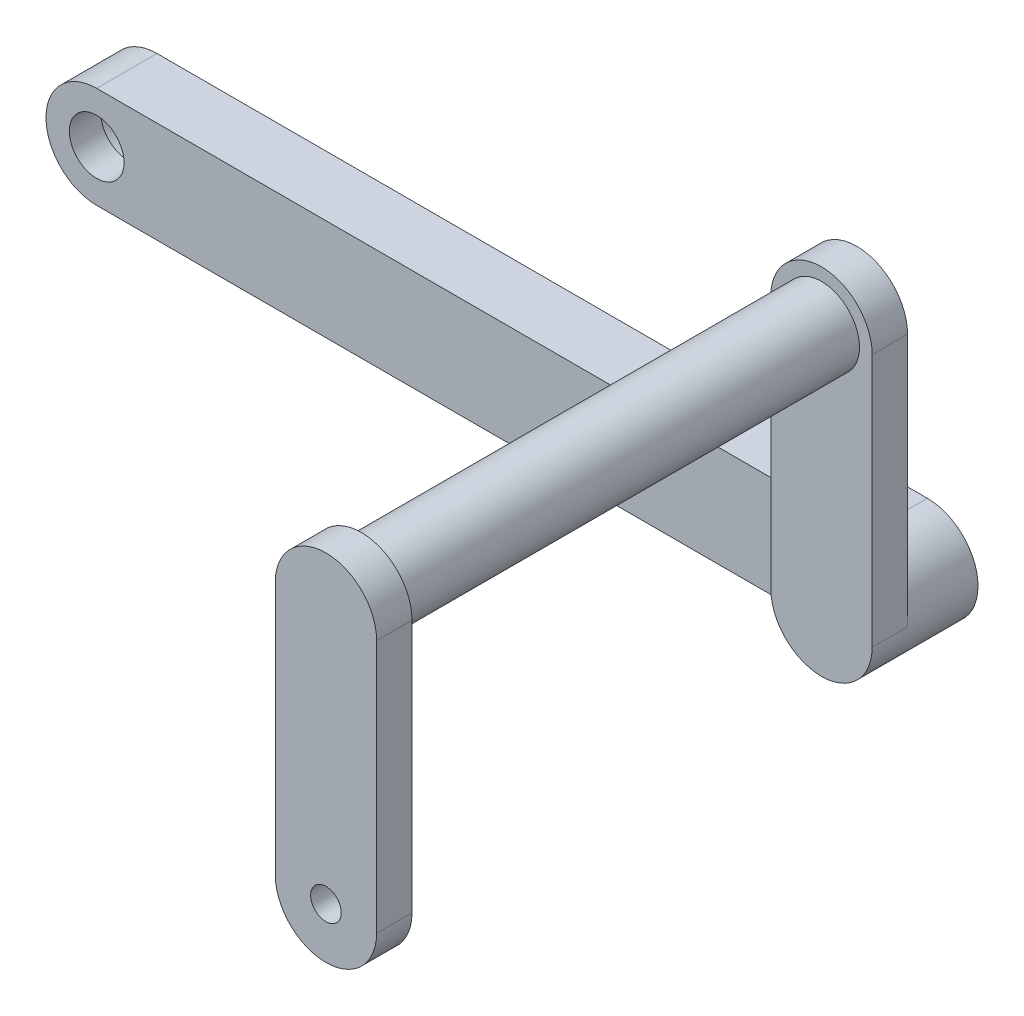
ISO-10303-21;
HEADER;
FILE_DESCRIPTION(('STEP AP214'),'2;1');
FILE_NAME('part.step','',(''),(''),'','','');
FILE_SCHEMA(('AUTOMOTIVE_DESIGN { 1 0 10303 214 1 1 1 1 }'));
ENDSEC;
DATA;
#1=APPLICATION_CONTEXT('core data for automotive mechanical design processes');
#2=APPLICATION_PROTOCOL_DEFINITION('international standard','automotive_design',2000,#1);
#3=PRODUCT_CONTEXT('',#1,'mechanical');
#4=PRODUCT('Part','Part','',(#3));
#5=PRODUCT_RELATED_PRODUCT_CATEGORY('part','',(#4));
#6=PRODUCT_DEFINITION_FORMATION('','',#4);
#7=PRODUCT_DEFINITION_CONTEXT('part definition',#1,'design');
#8=PRODUCT_DEFINITION('design','',#6,#7);
#9=PRODUCT_DEFINITION_SHAPE('','',#8);
#10=(LENGTH_UNIT() NAMED_UNIT(*) SI_UNIT(.MILLI.,.METRE.));
#11=(NAMED_UNIT(*) PLANE_ANGLE_UNIT() SI_UNIT($,.RADIAN.));
#12=(NAMED_UNIT(*) SI_UNIT($,.STERADIAN.) SOLID_ANGLE_UNIT());
#13=UNCERTAINTY_MEASURE_WITH_UNIT(LENGTH_MEASURE(1.E-05),#10,'distance_accuracy_value','');
#14=(GEOMETRIC_REPRESENTATION_CONTEXT(3) GLOBAL_UNCERTAINTY_ASSIGNED_CONTEXT((#13)) GLOBAL_UNIT_ASSIGNED_CONTEXT((#10,
#11,#12)) REPRESENTATION_CONTEXT('',''));
#15=CARTESIAN_POINT('',(0.,0.,0.));
#16=DIRECTION('',(0.,0.,1.));
#17=DIRECTION('',(1.,0.,0.));
#18=AXIS2_PLACEMENT_3D('',#15,#16,#17);
#19=CARTESIAN_POINT('',(0.,0.,3.75));
#20=DIRECTION('',(0.,0.,-1.));
#21=DIRECTION('',(-1.,0.,0.));
#22=AXIS2_PLACEMENT_3D('',#19,#20,#21);
#23=CYLINDRICAL_SURFACE('',#22,1.7);
#24=CARTESIAN_POINT('',(0.,0.,3.75));
#25=DIRECTION('',(0.,0.,1.));
#26=DIRECTION('',(1.,0.,0.));
#27=AXIS2_PLACEMENT_3D('',#24,#25,#26);
#28=CIRCLE('',#27,1.7);
#29=CARTESIAN_POINT('',(1.7,0.,3.75));
#30=VERTEX_POINT('',#29);
#31=EDGE_CURVE('E208',#30,#30,#28,.T.);
#32=ORIENTED_EDGE('',*,*,#31,.T.);
#33=EDGE_LOOP('',(#32));
#34=FACE_BOUND('',#33,.T.);
#35=CARTESIAN_POINT('',(0.,0.,1.8));
#36=DIRECTION('',(0.,0.,-1.));
#37=DIRECTION('',(-1.,0.,0.));
#38=AXIS2_PLACEMENT_3D('',#35,#36,#37);
#39=CIRCLE('',#38,1.7);
#40=CARTESIAN_POINT('',(-1.7,0.,1.8));
#41=VERTEX_POINT('',#40);
#42=EDGE_CURVE('E45',#41,#41,#39,.T.);
#43=ORIENTED_EDGE('',*,*,#42,.T.);
#44=EDGE_LOOP('',(#43));
#45=FACE_BOUND('',#44,.T.);
#46=ADVANCED_FACE('F41',(#34,#45),#23,.F.);
#47=CARTESIAN_POINT('',(47.88,0.,37.38));
#48=DIRECTION('',(0.,0.,-1.));
#49=DIRECTION('',(-1.,0.,0.));
#50=AXIS2_PLACEMENT_3D('',#47,#48,#49);
#51=CYLINDRICAL_SURFACE('',#50,0.950000000000001);
#52=CARTESIAN_POINT('',(47.88,0.,37.38));
#53=DIRECTION('',(0.,0.,1.));
#54=DIRECTION('',(1.,0.,0.));
#55=AXIS2_PLACEMENT_3D('',#52,#53,#54);
#56=CIRCLE('',#55,0.950000000000001);
#57=CARTESIAN_POINT('',(48.83,0.,37.38));
#58=VERTEX_POINT('',#57);
#59=EDGE_CURVE('E232',#58,#58,#56,.T.);
#60=ORIENTED_EDGE('',*,*,#59,.T.);
#61=EDGE_LOOP('',(#60));
#62=FACE_BOUND('',#61,.T.);
#63=CARTESIAN_POINT('',(47.88,0.,35.68));
#64=DIRECTION('',(0.,0.,-1.));
#65=DIRECTION('',(-1.,0.,0.));
#66=AXIS2_PLACEMENT_3D('',#63,#64,#65);
#67=CIRCLE('',#66,0.950000000000001);
#68=CARTESIAN_POINT('',(46.93,0.,35.68));
#69=VERTEX_POINT('',#68);
#70=EDGE_CURVE('E230',#69,#69,#67,.T.);
#71=ORIENTED_EDGE('',*,*,#70,.T.);
#72=EDGE_LOOP('',(#71));
#73=FACE_BOUND('',#72,.T.);
#74=ADVANCED_FACE('F278',(#62,#73),#51,.F.);
#75=CARTESIAN_POINT('',(0.,0.,3.75));
#76=DIRECTION('',(0.,0.,1.));
#77=DIRECTION('',(1.,0.,0.));
#78=AXIS2_PLACEMENT_3D('',#75,#76,#77);
#79=PLANE('',#78);
#80=CARTESIAN_POINT('',(47.88,0.,3.75));
#81=DIRECTION('',(0.,0.,1.));
#82=DIRECTION('',(1.,0.,0.));
#83=AXIS2_PLACEMENT_3D('',#80,#81,#82);
#84=CIRCLE('',#83,3.15);
#85=CARTESIAN_POINT('',(47.88,3.15,3.75));
#86=VERTEX_POINT('',#85);
#87=CARTESIAN_POINT('',(47.88,-3.15,3.75));
#88=VERTEX_POINT('',#87);
#89=EDGE_CURVE('E206',#86,#88,#84,.T.);
#90=ORIENTED_EDGE('',*,*,#89,.F.);
#91=DIRECTION('',(-1.,0.,0.));
#92=VECTOR('',#91,1.);
#93=CARTESIAN_POINT('',(0.,3.15,3.75));
#94=LINE('',#93,#92);
#95=CARTESIAN_POINT('',(0.,3.15,3.75));
#96=VERTEX_POINT('',#95);
#97=EDGE_CURVE('E67',#86,#96,#94,.T.);
#98=ORIENTED_EDGE('',*,*,#97,.T.);
#99=CARTESIAN_POINT('',(0.,0.,3.75));
#100=DIRECTION('',(0.,0.,1.));
#101=DIRECTION('',(1.,0.,0.));
#102=AXIS2_PLACEMENT_3D('',#99,#100,#101);
#103=CIRCLE('',#102,3.15);
#104=CARTESIAN_POINT('',(0.,-3.15,3.75));
#105=VERTEX_POINT('',#104);
#106=EDGE_CURVE('E214',#96,#105,#103,.T.);
#107=ORIENTED_EDGE('',*,*,#106,.T.);
#108=DIRECTION('',(1.,0.,0.));
#109=VECTOR('',#108,1.);
#110=CARTESIAN_POINT('',(0.,-3.15,3.75));
#111=LINE('',#110,#109);
#112=EDGE_CURVE('E93',#105,#88,#111,.T.);
#113=ORIENTED_EDGE('',*,*,#112,.T.);
#114=EDGE_LOOP('',(#90,#98,#107,#113));
#115=FACE_BOUND('',#114,.T.);
#116=ORIENTED_EDGE('',*,*,#31,.F.);
#117=EDGE_LOOP('',(#116));
#118=FACE_BOUND('',#117,.T.);
#119=ADVANCED_FACE('F286',(#115,#118),#79,.T.);
#120=CARTESIAN_POINT('',(0.,0.,0.));
#121=DIRECTION('',(0.,0.,1.));
#122=DIRECTION('',(1.,0.,0.));
#123=AXIS2_PLACEMENT_3D('',#120,#121,#122);
#124=PLANE('',#123);
#125=CARTESIAN_POINT('',(0.,0.,0.));
#126=DIRECTION('',(0.,0.,-1.));
#127=DIRECTION('',(-1.,0.,0.));
#128=AXIS2_PLACEMENT_3D('',#125,#126,#127);
#129=CIRCLE('',#128,2.5);
#130=CARTESIAN_POINT('',(-2.5,0.,0.));
#131=VERTEX_POINT('',#130);
#132=EDGE_CURVE('E246',#131,#131,#129,.T.);
#133=ORIENTED_EDGE('',*,*,#132,.F.);
#134=EDGE_LOOP('',(#133));
#135=FACE_BOUND('',#134,.T.);
#136=CARTESIAN_POINT('',(0.,0.,0.));
#137=DIRECTION('',(0.,0.,1.));
#138=DIRECTION('',(1.,0.,0.));
#139=AXIS2_PLACEMENT_3D('',#136,#137,#138);
#140=CIRCLE('',#139,3.15);
#141=CARTESIAN_POINT('',(0.,3.15,0.));
#142=VERTEX_POINT('',#141);
#143=CARTESIAN_POINT('',(0.,-3.15,0.));
#144=VERTEX_POINT('',#143);
#145=EDGE_CURVE('E213',#142,#144,#140,.T.);
#146=ORIENTED_EDGE('',*,*,#145,.F.);
#147=DIRECTION('',(-1.,0.,0.));
#148=VECTOR('',#147,1.);
#149=CARTESIAN_POINT('',(0.,3.15,0.));
#150=LINE('',#149,#148);
#151=CARTESIAN_POINT('',(47.88,3.15,0.));
#152=VERTEX_POINT('',#151);
#153=EDGE_CURVE('E88',#152,#142,#150,.T.);
#154=ORIENTED_EDGE('',*,*,#153,.F.);
#155=CARTESIAN_POINT('',(47.88,0.,0.));
#156=DIRECTION('',(0.,0.,1.));
#157=DIRECTION('',(1.,0.,0.));
#158=AXIS2_PLACEMENT_3D('',#155,#156,#157);
#159=CIRCLE('',#158,3.15);
#160=CARTESIAN_POINT('',(47.88,-3.15,0.));
#161=VERTEX_POINT('',#160);
#162=EDGE_CURVE('E223',#161,#152,#159,.T.);
#163=ORIENTED_EDGE('',*,*,#162,.F.);
#164=DIRECTION('',(1.,0.,0.));
#165=VECTOR('',#164,1.);
#166=CARTESIAN_POINT('',(0.,-3.15,0.));
#167=LINE('',#166,#165);
#168=EDGE_CURVE('E221',#144,#161,#167,.T.);
#169=ORIENTED_EDGE('',*,*,#168,.F.);
#170=EDGE_LOOP('',(#146,#154,#163,#169));
#171=FACE_BOUND('',#170,.T.);
#172=ADVANCED_FACE('F296',(#135,#171),#124,.F.);
#173=CARTESIAN_POINT('',(0.,0.,3.75));
#174=DIRECTION('',(0.,0.,-1.));
#175=DIRECTION('',(-1.,0.,0.));
#176=AXIS2_PLACEMENT_3D('',#173,#174,#175);
#177=CYLINDRICAL_SURFACE('',#176,3.15);
#178=ORIENTED_EDGE('',*,*,#145,.T.);
#179=DIRECTION('',(0.,0.,-1.));
#180=VECTOR('',#179,1.);
#181=CARTESIAN_POINT('',(0.,-3.15,3.75));
#182=LINE('',#181,#180);
#183=EDGE_CURVE('E11',#105,#144,#182,.T.);
#184=ORIENTED_EDGE('',*,*,#183,.F.);
#185=ORIENTED_EDGE('',*,*,#106,.F.);
#186=DIRECTION('',(0.,0.,-1.));
#187=VECTOR('',#186,1.);
#188=CARTESIAN_POINT('',(0.,3.15,3.75));
#189=LINE('',#188,#187);
#190=EDGE_CURVE('E218',#96,#142,#189,.T.);
#191=ORIENTED_EDGE('',*,*,#190,.T.);
#192=EDGE_LOOP('',(#178,#184,#185,#191));
#193=FACE_BOUND('',#192,.T.);
#194=ADVANCED_FACE('F43',(#193),#177,.T.);
#195=CARTESIAN_POINT('',(0.,-3.15,3.75));
#196=DIRECTION('',(0.,1.,0.));
#197=DIRECTION('',(-1.,0.,0.));
#198=AXIS2_PLACEMENT_3D('',#195,#196,#197);
#199=PLANE('',#198);
#200=ORIENTED_EDGE('',*,*,#168,.T.);
#201=DIRECTION('',(0.,0.,-1.));
#202=VECTOR('',#201,1.);
#203=CARTESIAN_POINT('',(47.88,-3.15,3.75));
#204=LINE('',#203,#202);
#205=EDGE_CURVE('E50',#88,#161,#204,.T.);
#206=ORIENTED_EDGE('',*,*,#205,.F.);
#207=ORIENTED_EDGE('',*,*,#112,.F.);
#208=ORIENTED_EDGE('',*,*,#183,.T.);
#209=EDGE_LOOP('',(#200,#206,#207,#208));
#210=FACE_BOUND('',#209,.T.);
#211=ADVANCED_FACE('F305',(#210),#199,.F.);
#212=CARTESIAN_POINT('',(47.88,0.,3.75));
#213=DIRECTION('',(0.,0.,-1.));
#214=DIRECTION('',(-1.,0.,0.));
#215=AXIS2_PLACEMENT_3D('',#212,#213,#214);
#216=CYLINDRICAL_SURFACE('',#215,3.15);
#217=ORIENTED_EDGE('',*,*,#162,.T.);
#218=DIRECTION('',(0.,0.,-1.));
#219=VECTOR('',#218,1.);
#220=CARTESIAN_POINT('',(47.88,3.15,3.75));
#221=LINE('',#220,#219);
#222=EDGE_CURVE('E227',#86,#152,#221,.T.);
#223=ORIENTED_EDGE('',*,*,#222,.F.);
#224=ORIENTED_EDGE('',*,*,#89,.T.);
#225=ORIENTED_EDGE('',*,*,#205,.T.);
#226=EDGE_LOOP('',(#217,#223,#224,#225));
#227=FACE_BOUND('',#226,.T.);
#228=CARTESIAN_POINT('',(47.88,0.,4.38));
#229=DIRECTION('',(0.,0.,1.));
#230=DIRECTION('',(1.,0.,0.));
#231=AXIS2_PLACEMENT_3D('',#228,#229,#230);
#232=CIRCLE('',#231,3.15);
#233=CARTESIAN_POINT('',(51.03,0.,4.38));
#234=VERTEX_POINT('',#233);
#235=CARTESIAN_POINT('',(44.73,0.,4.38));
#236=VERTEX_POINT('',#235);
#237=EDGE_CURVE('E58',#234,#236,#232,.T.);
#238=ORIENTED_EDGE('',*,*,#237,.F.);
#239=DIRECTION('',(0.,0.,-1.));
#240=VECTOR('',#239,1.);
#241=CARTESIAN_POINT('',(51.03,0.,6.58));
#242=LINE('',#241,#240);
#243=CARTESIAN_POINT('',(51.03,0.,6.58));
#244=VERTEX_POINT('',#243);
#245=EDGE_CURVE('E197',#244,#234,#242,.T.);
#246=ORIENTED_EDGE('',*,*,#245,.F.);
#247=CARTESIAN_POINT('',(47.88,0.,6.58));
#248=DIRECTION('',(0.,0.,1.));
#249=DIRECTION('',(1.,0.,0.));
#250=AXIS2_PLACEMENT_3D('',#247,#248,#249);
#251=CIRCLE('',#250,3.15);
#252=CARTESIAN_POINT('',(44.73,0.,6.58));
#253=VERTEX_POINT('',#252);
#254=EDGE_CURVE('E185',#253,#244,#251,.T.);
#255=ORIENTED_EDGE('',*,*,#254,.F.);
#256=DIRECTION('',(0.,0.,-1.));
#257=VECTOR('',#256,1.);
#258=CARTESIAN_POINT('',(44.73,0.,6.58));
#259=LINE('',#258,#257);
#260=EDGE_CURVE('E200',#253,#236,#259,.T.);
#261=ORIENTED_EDGE('',*,*,#260,.T.);
#262=EDGE_LOOP('',(#238,#246,#255,#261));
#263=FACE_BOUND('',#262,.T.);
#264=ADVANCED_FACE('F303',(#227,#263),#216,.T.);
#265=CARTESIAN_POINT('',(0.,3.15,3.75));
#266=DIRECTION('',(0.,-1.,0.));
#267=DIRECTION('',(1.,0.,0.));
#268=AXIS2_PLACEMENT_3D('',#265,#266,#267);
#269=PLANE('',#268);
#270=ORIENTED_EDGE('',*,*,#153,.T.);
#271=ORIENTED_EDGE('',*,*,#190,.F.);
#272=ORIENTED_EDGE('',*,*,#97,.F.);
#273=ORIENTED_EDGE('',*,*,#222,.T.);
#274=EDGE_LOOP('',(#270,#271,#272,#273));
#275=FACE_BOUND('',#274,.T.);
#276=ADVANCED_FACE('F299',(#275),#269,.F.);
#277=CARTESIAN_POINT('',(47.88,15.75,4.38));
#278=DIRECTION('',(0.,0.,1.));
#279=DIRECTION('',(1.,0.,0.));
#280=AXIS2_PLACEMENT_3D('',#277,#278,#279);
#281=PLANE('',#280);
#282=DIRECTION('',(0.,1.,0.));
#283=VECTOR('',#282,1.);
#284=CARTESIAN_POINT('',(51.03,15.75,4.38));
#285=LINE('',#284,#283);
#286=CARTESIAN_POINT('',(51.03,15.75,4.38));
#287=VERTEX_POINT('',#286);
#288=EDGE_CURVE('E183',#234,#287,#285,.T.);
#289=ORIENTED_EDGE('',*,*,#288,.F.);
#290=ORIENTED_EDGE('',*,*,#237,.T.);
#291=DIRECTION('',(0.,-1.,0.));
#292=VECTOR('',#291,1.);
#293=CARTESIAN_POINT('',(44.73,15.75,4.38));
#294=LINE('',#293,#292);
#295=CARTESIAN_POINT('',(44.73,15.75,4.38));
#296=VERTEX_POINT('',#295);
#297=EDGE_CURVE('E192',#296,#236,#294,.T.);
#298=ORIENTED_EDGE('',*,*,#297,.F.);
#299=CARTESIAN_POINT('',(47.88,15.75,4.38));
#300=DIRECTION('',(0.,0.,1.));
#301=DIRECTION('',(1.,0.,0.));
#302=AXIS2_PLACEMENT_3D('',#299,#300,#301);
#303=CIRCLE('',#302,3.15);
#304=EDGE_CURVE('E177',#287,#296,#303,.T.);
#305=ORIENTED_EDGE('',*,*,#304,.F.);
#306=EDGE_LOOP('',(#289,#290,#298,#305));
#307=FACE_BOUND('',#306,.T.);
#308=ADVANCED_FACE('F302',(#307),#281,.F.);
#309=CARTESIAN_POINT('',(47.88,15.75,6.58));
#310=DIRECTION('',(0.,0.,-1.));
#311=DIRECTION('',(-1.,0.,0.));
#312=AXIS2_PLACEMENT_3D('',#309,#310,#311);
#313=CYLINDRICAL_SURFACE('',#312,3.15);
#314=ORIENTED_EDGE('',*,*,#304,.T.);
#315=DIRECTION('',(0.,0.,-1.));
#316=VECTOR('',#315,1.);
#317=CARTESIAN_POINT('',(44.73,15.75,6.58));
#318=LINE('',#317,#316);
#319=CARTESIAN_POINT('',(44.73,15.75,6.58));
#320=VERTEX_POINT('',#319);
#321=EDGE_CURVE('E203',#320,#296,#318,.T.);
#322=ORIENTED_EDGE('',*,*,#321,.F.);
#323=CARTESIAN_POINT('',(47.88,15.75,6.58));
#324=DIRECTION('',(0.,0.,1.));
#325=DIRECTION('',(1.,0.,0.));
#326=AXIS2_PLACEMENT_3D('',#323,#324,#325);
#327=CIRCLE('',#326,3.15);
#328=CARTESIAN_POINT('',(51.03,15.75,6.58));
#329=VERTEX_POINT('',#328);
#330=EDGE_CURVE('E179',#329,#320,#327,.T.);
#331=ORIENTED_EDGE('',*,*,#330,.F.);
#332=DIRECTION('',(0.,0.,-1.));
#333=VECTOR('',#332,1.);
#334=CARTESIAN_POINT('',(51.03,15.75,6.58));
#335=LINE('',#334,#333);
#336=EDGE_CURVE('E189',#329,#287,#335,.T.);
#337=ORIENTED_EDGE('',*,*,#336,.T.);
#338=EDGE_LOOP('',(#314,#322,#331,#337));
#339=FACE_BOUND('',#338,.T.);
#340=ADVANCED_FACE('F292',(#339),#313,.T.);
#341=CARTESIAN_POINT('',(44.73,15.75,6.58));
#342=DIRECTION('',(1.,0.,0.));
#343=DIRECTION('',(0.,0.,-1.));
#344=AXIS2_PLACEMENT_3D('',#341,#342,#343);
#345=PLANE('',#344);
#346=ORIENTED_EDGE('',*,*,#297,.T.);
#347=ORIENTED_EDGE('',*,*,#260,.F.);
#348=DIRECTION('',(0.,-1.,0.));
#349=VECTOR('',#348,1.);
#350=CARTESIAN_POINT('',(44.73,15.75,6.58));
#351=LINE('',#350,#349);
#352=EDGE_CURVE('E182',#320,#253,#351,.T.);
#353=ORIENTED_EDGE('',*,*,#352,.F.);
#354=ORIENTED_EDGE('',*,*,#321,.T.);
#355=EDGE_LOOP('',(#346,#347,#353,#354));
#356=FACE_BOUND('',#355,.T.);
#357=ADVANCED_FACE('F335',(#356),#345,.F.);
#358=CARTESIAN_POINT('',(51.03,15.75,6.58));
#359=DIRECTION('',(-1.,0.,0.));
#360=DIRECTION('',(0.,0.,1.));
#361=AXIS2_PLACEMENT_3D('',#358,#359,#360);
#362=PLANE('',#361);
#363=ORIENTED_EDGE('',*,*,#288,.T.);
#364=ORIENTED_EDGE('',*,*,#336,.F.);
#365=DIRECTION('',(0.,1.,0.));
#366=VECTOR('',#365,1.);
#367=CARTESIAN_POINT('',(51.03,15.75,6.58));
#368=LINE('',#367,#366);
#369=EDGE_CURVE('E187',#244,#329,#368,.T.);
#370=ORIENTED_EDGE('',*,*,#369,.F.);
#371=ORIENTED_EDGE('',*,*,#245,.T.);
#372=EDGE_LOOP('',(#363,#364,#370,#371));
#373=FACE_BOUND('',#372,.T.);
#374=ADVANCED_FACE('F326',(#373),#362,.F.);
#375=CARTESIAN_POINT('',(47.88,15.75,6.58));
#376=DIRECTION('',(0.,0.,1.));
#377=DIRECTION('',(1.,0.,0.));
#378=AXIS2_PLACEMENT_3D('',#375,#376,#377);
#379=PLANE('',#378);
#380=CARTESIAN_POINT('',(47.88,15.75,6.58));
#381=DIRECTION('',(0.,0.,1.));
#382=DIRECTION('',(1.,0.,0.));
#383=AXIS2_PLACEMENT_3D('',#380,#381,#382);
#384=CIRCLE('',#383,2.365);
#385=CARTESIAN_POINT('',(50.245,15.75,6.58));
#386=VERTEX_POINT('',#385);
#387=EDGE_CURVE('E167',#386,#386,#384,.T.);
#388=ORIENTED_EDGE('',*,*,#387,.F.);
#389=EDGE_LOOP('',(#388));
#390=FACE_BOUND('',#389,.T.);
#391=ORIENTED_EDGE('',*,*,#330,.T.);
#392=ORIENTED_EDGE('',*,*,#352,.T.);
#393=ORIENTED_EDGE('',*,*,#254,.T.);
#394=ORIENTED_EDGE('',*,*,#369,.T.);
#395=EDGE_LOOP('',(#391,#392,#393,#394));
#396=FACE_BOUND('',#395,.T.);
#397=ADVANCED_FACE('F333',(#390,#396),#379,.T.);
#398=CARTESIAN_POINT('',(47.88,15.75,35.18));
#399=DIRECTION('',(0.,0.,-1.));
#400=DIRECTION('',(-1.,0.,0.));
#401=AXIS2_PLACEMENT_3D('',#398,#399,#400);
#402=CYLINDRICAL_SURFACE('',#401,2.365);
#403=CARTESIAN_POINT('',(47.88,15.75,35.18));
#404=DIRECTION('',(0.,0.,1.));
#405=DIRECTION('',(1.,0.,0.));
#406=AXIS2_PLACEMENT_3D('',#403,#404,#405);
#407=CIRCLE('',#406,2.365);
#408=CARTESIAN_POINT('',(50.245,15.75,35.18));
#409=VERTEX_POINT('',#408);
#410=EDGE_CURVE('E170',#409,#409,#407,.T.);
#411=ORIENTED_EDGE('',*,*,#410,.F.);
#412=EDGE_LOOP('',(#411));
#413=FACE_BOUND('',#412,.T.);
#414=ORIENTED_EDGE('',*,*,#387,.T.);
#415=EDGE_LOOP('',(#414));
#416=FACE_BOUND('',#415,.T.);
#417=ADVANCED_FACE('F347',(#413,#416),#402,.T.);
#418=CARTESIAN_POINT('',(47.88,15.75,37.38));
#419=DIRECTION('',(0.,0.,1.));
#420=DIRECTION('',(1.,0.,0.));
#421=AXIS2_PLACEMENT_3D('',#418,#419,#420);
#422=PLANE('',#421);
#423=CARTESIAN_POINT('',(47.88,15.75,37.38));
#424=DIRECTION('',(0.,0.,1.));
#425=DIRECTION('',(1.,0.,0.));
#426=AXIS2_PLACEMENT_3D('',#423,#424,#425);
#427=CIRCLE('',#426,3.15);
#428=CARTESIAN_POINT('',(51.03,15.75,37.38));
#429=VERTEX_POINT('',#428);
#430=CARTESIAN_POINT('',(44.73,15.75,37.38));
#431=VERTEX_POINT('',#430);
#432=EDGE_CURVE('E152',#429,#431,#427,.T.);
#433=ORIENTED_EDGE('',*,*,#432,.T.);
#434=DIRECTION('',(0.,-1.,0.));
#435=VECTOR('',#434,1.);
#436=CARTESIAN_POINT('',(44.73,15.75,37.38));
#437=LINE('',#436,#435);
#438=CARTESIAN_POINT('',(44.73,0.,37.38));
#439=VERTEX_POINT('',#438);
#440=EDGE_CURVE('E141',#431,#439,#437,.T.);
#441=ORIENTED_EDGE('',*,*,#440,.T.);
#442=CARTESIAN_POINT('',(47.88,0.,37.38));
#443=DIRECTION('',(0.,0.,1.));
#444=DIRECTION('',(1.,0.,0.));
#445=AXIS2_PLACEMENT_3D('',#442,#443,#444);
#446=CIRCLE('',#445,3.15);
#447=CARTESIAN_POINT('',(51.03,0.,37.38));
#448=VERTEX_POINT('',#447);
#449=EDGE_CURVE('E151',#439,#448,#446,.T.);
#450=ORIENTED_EDGE('',*,*,#449,.T.);
#451=DIRECTION('',(0.,1.,0.));
#452=VECTOR('',#451,1.);
#453=CARTESIAN_POINT('',(51.03,15.75,37.38));
#454=LINE('',#453,#452);
#455=EDGE_CURVE('E158',#448,#429,#454,.T.);
#456=ORIENTED_EDGE('',*,*,#455,.T.);
#457=EDGE_LOOP('',(#433,#441,#450,#456));
#458=FACE_BOUND('',#457,.T.);
#459=ORIENTED_EDGE('',*,*,#59,.F.);
#460=EDGE_LOOP('',(#459));
#461=FACE_BOUND('',#460,.T.);
#462=ADVANCED_FACE('F155',(#458,#461),#422,.T.);
#463=CARTESIAN_POINT('',(47.88,15.75,35.18));
#464=DIRECTION('',(0.,0.,1.));
#465=DIRECTION('',(1.,0.,0.));
#466=AXIS2_PLACEMENT_3D('',#463,#464,#465);
#467=PLANE('',#466);
#468=CARTESIAN_POINT('',(47.88,0.,35.18));
#469=DIRECTION('',(0.,0.,-1.));
#470=DIRECTION('',(-1.,0.,0.));
#471=AXIS2_PLACEMENT_3D('',#468,#469,#470);
#472=CIRCLE('',#471,1.25);
#473=CARTESIAN_POINT('',(46.63,0.,35.18));
#474=VERTEX_POINT('',#473);
#475=EDGE_CURVE('E239',#474,#474,#472,.T.);
#476=ORIENTED_EDGE('',*,*,#475,.F.);
#477=EDGE_LOOP('',(#476));
#478=FACE_BOUND('',#477,.T.);
#479=ORIENTED_EDGE('',*,*,#410,.T.);
#480=EDGE_LOOP('',(#479));
#481=FACE_BOUND('',#480,.T.);
#482=CARTESIAN_POINT('',(47.88,15.75,35.18));
#483=DIRECTION('',(0.,0.,1.));
#484=DIRECTION('',(1.,0.,0.));
#485=AXIS2_PLACEMENT_3D('',#482,#483,#484);
#486=CIRCLE('',#485,3.15);
#487=CARTESIAN_POINT('',(51.03,15.75,35.18));
#488=VERTEX_POINT('',#487);
#489=CARTESIAN_POINT('',(44.73,15.75,35.18));
#490=VERTEX_POINT('',#489);
#491=EDGE_CURVE('E166',#488,#490,#486,.T.);
#492=ORIENTED_EDGE('',*,*,#491,.F.);
#493=DIRECTION('',(0.,1.,0.));
#494=VECTOR('',#493,1.);
#495=CARTESIAN_POINT('',(51.03,15.75,35.18));
#496=LINE('',#495,#494);
#497=CARTESIAN_POINT('',(51.03,0.,35.18));
#498=VERTEX_POINT('',#497);
#499=EDGE_CURVE('E162',#498,#488,#496,.T.);
#500=ORIENTED_EDGE('',*,*,#499,.F.);
#501=CARTESIAN_POINT('',(47.88,0.,35.18));
#502=DIRECTION('',(0.,0.,1.));
#503=DIRECTION('',(1.,0.,0.));
#504=AXIS2_PLACEMENT_3D('',#501,#502,#503);
#505=CIRCLE('',#504,3.15);
#506=CARTESIAN_POINT('',(44.73,0.,35.18));
#507=VERTEX_POINT('',#506);
#508=EDGE_CURVE('E255',#507,#498,#505,.T.);
#509=ORIENTED_EDGE('',*,*,#508,.F.);
#510=DIRECTION('',(0.,-1.,0.));
#511=VECTOR('',#510,1.);
#512=CARTESIAN_POINT('',(44.73,15.75,35.18));
#513=LINE('',#512,#511);
#514=EDGE_CURVE('E253',#490,#507,#513,.T.);
#515=ORIENTED_EDGE('',*,*,#514,.F.);
#516=EDGE_LOOP('',(#492,#500,#509,#515));
#517=FACE_BOUND('',#516,.T.);
#518=ADVANCED_FACE('F266',(#478,#481,#517),#467,.F.);
#519=CARTESIAN_POINT('',(47.88,15.75,37.38));
#520=DIRECTION('',(0.,0.,-1.));
#521=DIRECTION('',(-1.,0.,0.));
#522=AXIS2_PLACEMENT_3D('',#519,#520,#521);
#523=CYLINDRICAL_SURFACE('',#522,3.15);
#524=ORIENTED_EDGE('',*,*,#491,.T.);
#525=DIRECTION('',(0.,0.,-1.));
#526=VECTOR('',#525,1.);
#527=CARTESIAN_POINT('',(44.73,15.75,37.38));
#528=LINE('',#527,#526);
#529=EDGE_CURVE('E145',#431,#490,#528,.T.);
#530=ORIENTED_EDGE('',*,*,#529,.F.);
#531=ORIENTED_EDGE('',*,*,#432,.F.);
#532=DIRECTION('',(0.,0.,-1.));
#533=VECTOR('',#532,1.);
#534=CARTESIAN_POINT('',(51.03,15.75,37.38));
#535=LINE('',#534,#533);
#536=EDGE_CURVE('E251',#429,#488,#535,.T.);
#537=ORIENTED_EDGE('',*,*,#536,.T.);
#538=EDGE_LOOP('',(#524,#530,#531,#537));
#539=FACE_BOUND('',#538,.T.);
#540=ADVANCED_FACE('F164',(#539),#523,.T.);
#541=CARTESIAN_POINT('',(44.73,15.75,37.38));
#542=DIRECTION('',(1.,0.,0.));
#543=DIRECTION('',(0.,0.,-1.));
#544=AXIS2_PLACEMENT_3D('',#541,#542,#543);
#545=PLANE('',#544);
#546=ORIENTED_EDGE('',*,*,#514,.T.);
#547=DIRECTION('',(0.,0.,-1.));
#548=VECTOR('',#547,1.);
#549=CARTESIAN_POINT('',(44.73,0.,37.38));
#550=LINE('',#549,#548);
#551=EDGE_CURVE('E148',#439,#507,#550,.T.);
#552=ORIENTED_EDGE('',*,*,#551,.F.);
#553=ORIENTED_EDGE('',*,*,#440,.F.);
#554=ORIENTED_EDGE('',*,*,#529,.T.);
#555=EDGE_LOOP('',(#546,#552,#553,#554));
#556=FACE_BOUND('',#555,.T.);
#557=ADVANCED_FACE('F143',(#556),#545,.F.);
#558=CARTESIAN_POINT('',(47.88,0.,37.38));
#559=DIRECTION('',(0.,0.,-1.));
#560=DIRECTION('',(-1.,0.,0.));
#561=AXIS2_PLACEMENT_3D('',#558,#559,#560);
#562=CYLINDRICAL_SURFACE('',#561,3.15);
#563=ORIENTED_EDGE('',*,*,#508,.T.);
#564=DIRECTION('',(0.,0.,-1.));
#565=VECTOR('',#564,1.);
#566=CARTESIAN_POINT('',(51.03,0.,37.38));
#567=LINE('',#566,#565);
#568=EDGE_CURVE('E172',#448,#498,#567,.T.);
#569=ORIENTED_EDGE('',*,*,#568,.F.);
#570=ORIENTED_EDGE('',*,*,#449,.F.);
#571=ORIENTED_EDGE('',*,*,#551,.T.);
#572=EDGE_LOOP('',(#563,#569,#570,#571));
#573=FACE_BOUND('',#572,.T.);
#574=ADVANCED_FACE('F267',(#573),#562,.T.);
#575=CARTESIAN_POINT('',(51.03,15.75,37.38));
#576=DIRECTION('',(-1.,0.,0.));
#577=DIRECTION('',(0.,0.,1.));
#578=AXIS2_PLACEMENT_3D('',#575,#576,#577);
#579=PLANE('',#578);
#580=ORIENTED_EDGE('',*,*,#499,.T.);
#581=ORIENTED_EDGE('',*,*,#536,.F.);
#582=ORIENTED_EDGE('',*,*,#455,.F.);
#583=ORIENTED_EDGE('',*,*,#568,.T.);
#584=EDGE_LOOP('',(#580,#581,#582,#583));
#585=FACE_BOUND('',#584,.T.);
#586=ADVANCED_FACE('F262',(#585),#579,.F.);
#587=CARTESIAN_POINT('',(47.88,0.,35.68));
#588=DIRECTION('',(0.,0.,-1.));
#589=DIRECTION('',(-1.,0.,0.));
#590=AXIS2_PLACEMENT_3D('',#587,#588,#589);
#591=CYLINDRICAL_SURFACE('',#590,1.25);
#592=CARTESIAN_POINT('',(47.88,0.,35.68));
#593=DIRECTION('',(0.,0.,-1.));
#594=DIRECTION('',(-1.,0.,0.));
#595=AXIS2_PLACEMENT_3D('',#592,#593,#594);
#596=CIRCLE('',#595,1.25);
#597=CARTESIAN_POINT('',(46.63,0.,35.68));
#598=VERTEX_POINT('',#597);
#599=EDGE_CURVE('E233',#598,#598,#596,.T.);
#600=ORIENTED_EDGE('',*,*,#599,.F.);
#601=EDGE_LOOP('',(#600));
#602=FACE_BOUND('',#601,.T.);
#603=ORIENTED_EDGE('',*,*,#475,.T.);
#604=EDGE_LOOP('',(#603));
#605=FACE_BOUND('',#604,.T.);
#606=ADVANCED_FACE('F274',(#602,#605),#591,.F.);
#607=CARTESIAN_POINT('',(47.88,0.,35.68));
#608=DIRECTION('',(0.,0.,-1.));
#609=DIRECTION('',(-1.,0.,0.));
#610=AXIS2_PLACEMENT_3D('',#607,#608,#609);
#611=PLANE('',#610);
#612=ORIENTED_EDGE('',*,*,#70,.F.);
#613=EDGE_LOOP('',(#612));
#614=FACE_BOUND('',#613,.T.);
#615=ORIENTED_EDGE('',*,*,#599,.T.);
#616=EDGE_LOOP('',(#615));
#617=FACE_BOUND('',#616,.T.);
#618=ADVANCED_FACE('F367',(#614,#617),#611,.T.);
#619=CARTESIAN_POINT('',(0.,0.,1.8));
#620=DIRECTION('',(0.,0.,-1.));
#621=DIRECTION('',(-1.,0.,0.));
#622=AXIS2_PLACEMENT_3D('',#619,#620,#621);
#623=CYLINDRICAL_SURFACE('',#622,2.5);
#624=CARTESIAN_POINT('',(0.,0.,1.8));
#625=DIRECTION('',(0.,0.,-1.));
#626=DIRECTION('',(-1.,0.,0.));
#627=AXIS2_PLACEMENT_3D('',#624,#625,#626);
#628=CIRCLE('',#627,2.5);
#629=CARTESIAN_POINT('',(-2.5,0.,1.8));
#630=VERTEX_POINT('',#629);
#631=EDGE_CURVE('E385',#630,#630,#628,.T.);
#632=ORIENTED_EDGE('',*,*,#631,.F.);
#633=EDGE_LOOP('',(#632));
#634=FACE_BOUND('',#633,.T.);
#635=ORIENTED_EDGE('',*,*,#132,.T.);
#636=EDGE_LOOP('',(#635));
#637=FACE_BOUND('',#636,.T.);
#638=ADVANCED_FACE('F370',(#634,#637),#623,.F.);
#639=CARTESIAN_POINT('',(0.,0.,1.8));
#640=DIRECTION('',(0.,0.,-1.));
#641=DIRECTION('',(-1.,0.,0.));
#642=AXIS2_PLACEMENT_3D('',#639,#640,#641);
#643=PLANE('',#642);
#644=ORIENTED_EDGE('',*,*,#42,.F.);
#645=EDGE_LOOP('',(#644));
#646=FACE_BOUND('',#645,.T.);
#647=ORIENTED_EDGE('',*,*,#631,.T.);
#648=EDGE_LOOP('',(#647));
#649=FACE_BOUND('',#648,.T.);
#650=ADVANCED_FACE('F374',(#646,#649),#643,.T.);
#651=CLOSED_SHELL('',(#46,#74,#119,#172,#194,#211,#264,#276,#308,#340,#357,#374,#397,#417,#462,
#518,#540,#557,#574,#586,#606,#618,#638,#650));
#652=MANIFOLD_SOLID_BREP('B2',#651);
#653=ADVANCED_BREP_SHAPE_REPRESENTATION('',(#18,#652),#14);
#654=SHAPE_DEFINITION_REPRESENTATION(#9,#653);
ENDSEC;
END-ISO-10303-21;
